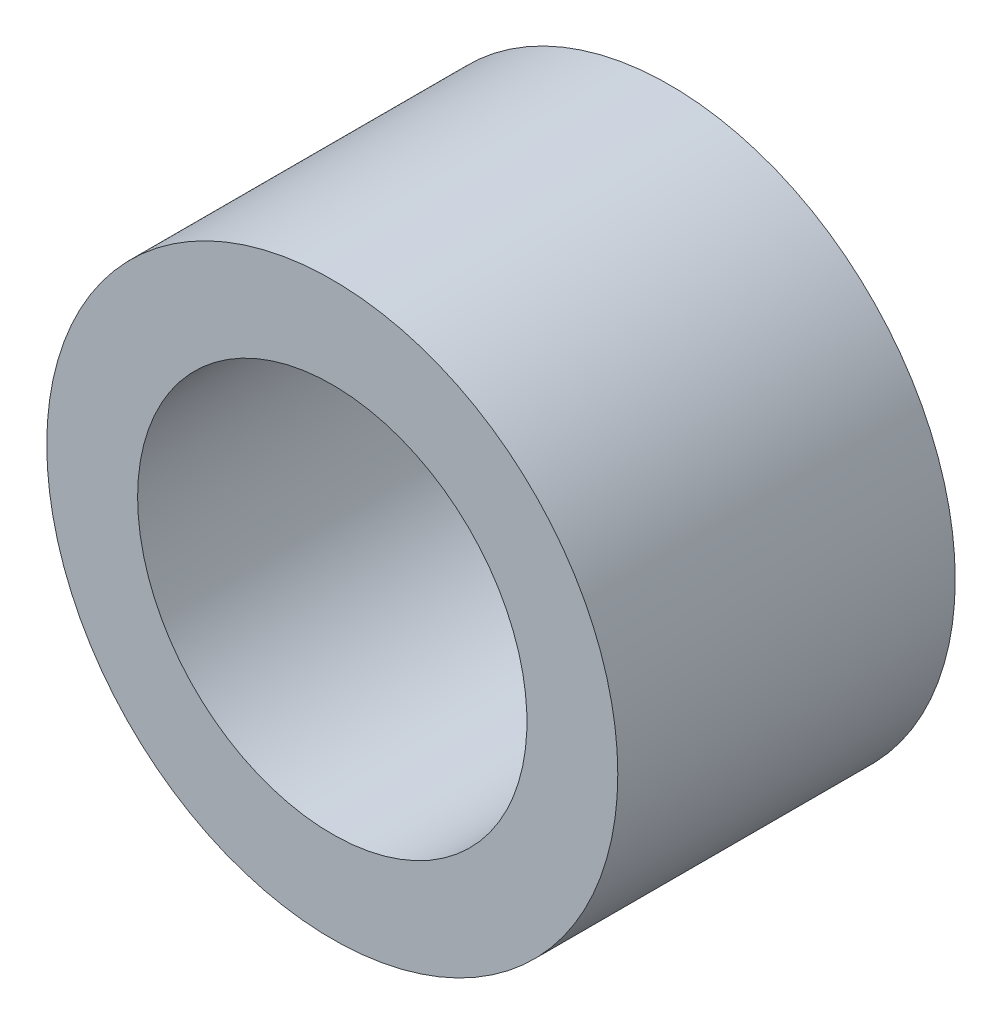
ISO-10303-21;
HEADER;
FILE_DESCRIPTION(('STEP AP214'),'2;1');
FILE_NAME('part.step','',(''),(''),'','','');
FILE_SCHEMA(('AUTOMOTIVE_DESIGN { 1 0 10303 214 1 1 1 1 }'));
ENDSEC;
DATA;
#1=APPLICATION_CONTEXT('core data for automotive mechanical design processes');
#2=APPLICATION_PROTOCOL_DEFINITION('international standard','automotive_design',2000,#1);
#3=PRODUCT_CONTEXT('',#1,'mechanical');
#4=PRODUCT('Part','Part','',(#3));
#5=PRODUCT_RELATED_PRODUCT_CATEGORY('part','',(#4));
#6=PRODUCT_DEFINITION_FORMATION('','',#4);
#7=PRODUCT_DEFINITION_CONTEXT('part definition',#1,'design');
#8=PRODUCT_DEFINITION('design','',#6,#7);
#9=PRODUCT_DEFINITION_SHAPE('','',#8);
#10=(LENGTH_UNIT() NAMED_UNIT(*) SI_UNIT(.MILLI.,.METRE.));
#11=(NAMED_UNIT(*) PLANE_ANGLE_UNIT() SI_UNIT($,.RADIAN.));
#12=(NAMED_UNIT(*) SI_UNIT($,.STERADIAN.) SOLID_ANGLE_UNIT());
#13=UNCERTAINTY_MEASURE_WITH_UNIT(LENGTH_MEASURE(1.E-05),#10,'distance_accuracy_value','');
#14=(GEOMETRIC_REPRESENTATION_CONTEXT(3) GLOBAL_UNCERTAINTY_ASSIGNED_CONTEXT((#13)) GLOBAL_UNIT_ASSIGNED_CONTEXT((#10,
#11,#12)) REPRESENTATION_CONTEXT('',''));
#15=CARTESIAN_POINT('',(0.,0.,0.));
#16=DIRECTION('',(0.,0.,1.));
#17=DIRECTION('',(1.,0.,0.));
#18=AXIS2_PLACEMENT_3D('',#15,#16,#17);
#19=CARTESIAN_POINT('',(0.,0.,13.));
#20=DIRECTION('',(0.,0.,1.));
#21=DIRECTION('',(1.,0.,0.));
#22=AXIS2_PLACEMENT_3D('',#19,#20,#21);
#23=PLANE('',#22);
#24=CARTESIAN_POINT('',(0.,0.,13.));
#25=DIRECTION('',(0.,0.,1.));
#26=DIRECTION('',(1.,0.,0.));
#27=AXIS2_PLACEMENT_3D('',#24,#25,#26);
#28=CIRCLE('',#27,11.);
#29=CARTESIAN_POINT('',(-11.,0.,13.));
#30=VERTEX_POINT('',#29);
#31=EDGE_CURVE('E10',#30,#30,#28,.T.);
#32=ORIENTED_EDGE('',*,*,#31,.T.);
#33=EDGE_LOOP('',(#32));
#34=FACE_BOUND('',#33,.T.);
#35=CARTESIAN_POINT('',(0.,0.,13.));
#36=DIRECTION('',(0.,0.,1.));
#37=DIRECTION('',(1.,0.,0.));
#38=AXIS2_PLACEMENT_3D('',#35,#36,#37);
#39=CIRCLE('',#38,7.5);
#40=CARTESIAN_POINT('',(-7.5,0.,13.));
#41=VERTEX_POINT('',#40);
#42=EDGE_CURVE('E50',#41,#41,#39,.T.);
#43=ORIENTED_EDGE('',*,*,#42,.F.);
#44=EDGE_LOOP('',(#43));
#45=FACE_BOUND('',#44,.T.);
#46=ADVANCED_FACE('F37',(#34,#45),#23,.T.);
#47=CARTESIAN_POINT('',(0.,0.,0.));
#48=DIRECTION('',(0.,0.,1.));
#49=DIRECTION('',(1.,0.,0.));
#50=AXIS2_PLACEMENT_3D('',#47,#48,#49);
#51=PLANE('',#50);
#52=CARTESIAN_POINT('',(0.,0.,0.));
#53=DIRECTION('',(0.,0.,1.));
#54=DIRECTION('',(1.,0.,0.));
#55=AXIS2_PLACEMENT_3D('',#52,#53,#54);
#56=CIRCLE('',#55,11.);
#57=CARTESIAN_POINT('',(-11.,0.,0.));
#58=VERTEX_POINT('',#57);
#59=EDGE_CURVE('E41',#58,#58,#56,.T.);
#60=ORIENTED_EDGE('',*,*,#59,.F.);
#61=EDGE_LOOP('',(#60));
#62=FACE_BOUND('',#61,.T.);
#63=CARTESIAN_POINT('',(0.,0.,0.));
#64=DIRECTION('',(0.,0.,1.));
#65=DIRECTION('',(1.,0.,0.));
#66=AXIS2_PLACEMENT_3D('',#63,#64,#65);
#67=CIRCLE('',#66,7.5);
#68=CARTESIAN_POINT('',(-7.5,0.,0.));
#69=VERTEX_POINT('',#68);
#70=EDGE_CURVE('E52',#69,#69,#67,.T.);
#71=ORIENTED_EDGE('',*,*,#70,.T.);
#72=EDGE_LOOP('',(#71));
#73=FACE_BOUND('',#72,.T.);
#74=ADVANCED_FACE('F64',(#62,#73),#51,.F.);
#75=CARTESIAN_POINT('',(0.,0.,13.));
#76=DIRECTION('',(0.,0.,-1.));
#77=DIRECTION('',(-1.,0.,0.));
#78=AXIS2_PLACEMENT_3D('',#75,#76,#77);
#79=CYLINDRICAL_SURFACE('',#78,11.);
#80=CARTESIAN_POINT('',(-11.,0.,13.));
#81=CARTESIAN_POINT('',(-11.,0.,12.8645833333333));
#82=CARTESIAN_POINT('',(-11.,0.,12.7291666666667));
#83=CARTESIAN_POINT('',(-11.,0.,12.4583333333333));
#84=CARTESIAN_POINT('',(-11.,0.,12.3229166666667));
#85=CARTESIAN_POINT('',(-11.,0.,12.0520833333333));
#86=CARTESIAN_POINT('',(-11.,0.,11.9166666666667));
#87=CARTESIAN_POINT('',(-11.,0.,11.6458333333333));
#88=CARTESIAN_POINT('',(-11.,0.,11.5104166666667));
#89=CARTESIAN_POINT('',(-11.,0.,11.2395833333333));
#90=CARTESIAN_POINT('',(-11.,0.,11.1041666666667));
#91=CARTESIAN_POINT('',(-11.,0.,10.8333333333333));
#92=CARTESIAN_POINT('',(-11.,0.,10.6979166666667));
#93=CARTESIAN_POINT('',(-11.,0.,10.4270833333333));
#94=CARTESIAN_POINT('',(-11.,0.,10.2916666666667));
#95=CARTESIAN_POINT('',(-11.,0.,10.0208333333333));
#96=CARTESIAN_POINT('',(-11.,0.,9.88541666666667));
#97=CARTESIAN_POINT('',(-11.,0.,9.61458333333333));
#98=CARTESIAN_POINT('',(-11.,0.,9.47916666666667));
#99=CARTESIAN_POINT('',(-11.,0.,9.20833333333333));
#100=CARTESIAN_POINT('',(-11.,0.,9.07291666666666));
#101=CARTESIAN_POINT('',(-11.,0.,8.80208333333333));
#102=CARTESIAN_POINT('',(-11.,0.,8.66666666666667));
#103=CARTESIAN_POINT('',(-11.,0.,8.39583333333333));
#104=CARTESIAN_POINT('',(-11.,0.,8.26041666666667));
#105=CARTESIAN_POINT('',(-11.,0.,7.98958333333333));
#106=CARTESIAN_POINT('',(-11.,0.,7.85416666666667));
#107=CARTESIAN_POINT('',(-11.,0.,7.58333333333333));
#108=CARTESIAN_POINT('',(-11.,0.,7.44791666666667));
#109=CARTESIAN_POINT('',(-11.,0.,7.17708333333333));
#110=CARTESIAN_POINT('',(-11.,0.,7.04166666666667));
#111=CARTESIAN_POINT('',(-11.,0.,6.77083333333333));
#112=CARTESIAN_POINT('',(-11.,0.,6.63541666666667));
#113=CARTESIAN_POINT('',(-11.,0.,6.36458333333333));
#114=CARTESIAN_POINT('',(-11.,0.,6.22916666666667));
#115=CARTESIAN_POINT('',(-11.,0.,5.95833333333333));
#116=CARTESIAN_POINT('',(-11.,0.,5.82291666666667));
#117=CARTESIAN_POINT('',(-11.,0.,5.55208333333333));
#118=CARTESIAN_POINT('',(-11.,0.,5.41666666666667));
#119=CARTESIAN_POINT('',(-11.,0.,5.14583333333333));
#120=CARTESIAN_POINT('',(-11.,0.,5.01041666666667));
#121=CARTESIAN_POINT('',(-11.,0.,4.73958333333333));
#122=CARTESIAN_POINT('',(-11.,0.,4.60416666666667));
#123=CARTESIAN_POINT('',(-11.,0.,4.33333333333333));
#124=CARTESIAN_POINT('',(-11.,0.,4.19791666666667));
#125=CARTESIAN_POINT('',(-11.,0.,3.92708333333333));
#126=CARTESIAN_POINT('',(-11.,0.,3.79166666666667));
#127=CARTESIAN_POINT('',(-11.,0.,3.52083333333333));
#128=CARTESIAN_POINT('',(-11.,0.,3.38541666666667));
#129=CARTESIAN_POINT('',(-11.,0.,3.11458333333333));
#130=CARTESIAN_POINT('',(-11.,0.,2.97916666666667));
#131=CARTESIAN_POINT('',(-11.,0.,2.70833333333333));
#132=CARTESIAN_POINT('',(-11.,0.,2.57291666666667));
#133=CARTESIAN_POINT('',(-11.,0.,2.30208333333333));
#134=CARTESIAN_POINT('',(-11.,0.,2.16666666666667));
#135=CARTESIAN_POINT('',(-11.,0.,1.89583333333333));
#136=CARTESIAN_POINT('',(-11.,0.,1.76041666666667));
#137=CARTESIAN_POINT('',(-11.,0.,1.48958333333333));
#138=CARTESIAN_POINT('',(-11.,0.,1.35416666666667));
#139=CARTESIAN_POINT('',(-11.,0.,1.08333333333333));
#140=CARTESIAN_POINT('',(-11.,0.,0.947916666666667));
#141=CARTESIAN_POINT('',(-11.,0.,0.677083333333334));
#142=CARTESIAN_POINT('',(-11.,0.,0.541666666666667));
#143=CARTESIAN_POINT('',(-11.,0.,0.270833333333334));
#144=CARTESIAN_POINT('',(-11.,0.,0.135416666666667));
#145=CARTESIAN_POINT('',(-11.,0.,0.));
#146=B_SPLINE_CURVE_WITH_KNOTS('',3,(#80,#81,#82,#83,#84,#85,#86,#87,#88,#89,#90,#91,#92,#93,
#94,#95,#96,#97,#98,#99,#100,#101,#102,#103,#104,#105,#106,#107,#108,#109,#110,#111,#112,#113,
#114,#115,#116,#117,#118,#119,#120,#121,#122,#123,#124,#125,#126,#127,#128,#129,#130,#131,#132,
#133,#134,#135,#136,#137,#138,#139,#140,#141,#142,#143,#144,#145),.UNSPECIFIED.,.F.,.F.,(4,2,2,
2,2,2,2,2,2,2,2,2,2,2,2,2,2,2,2,2,2,2,2,2,2,2,2,2,2,2,2,2,4),(0.,0.40625,0.812500000000001,
1.21875,1.625,2.03125,2.4375,2.84375,3.25,3.65625,4.0625,4.46875,4.875,5.28125,5.6875,6.09375,
6.5,6.90625,7.3125,7.71875,8.125,8.53125,8.9375,9.34375,9.75,10.15625,10.5625,10.96875,11.375,
11.78125,12.1875,12.59375,13.),.UNSPECIFIED.);
#147=EDGE_CURVE('BSEAM39',#30,#58,#146,.T.);
#148=ORIENTED_EDGE('',*,*,#31,.F.);
#149=ORIENTED_EDGE('',*,*,#59,.T.);
#150=ORIENTED_EDGE('',*,*,#147,.T.);
#151=ORIENTED_EDGE('',*,*,#147,.F.);
#152=EDGE_LOOP('',(#148,#150,#149,#151));
#153=FACE_BOUND('',#152,.T.);
#154=ADVANCED_FACE('F39',(#153),#79,.T.);
#155=CARTESIAN_POINT('',(0.,0.,13.));
#156=DIRECTION('',(0.,0.,-1.));
#157=DIRECTION('',(-1.,0.,0.));
#158=AXIS2_PLACEMENT_3D('',#155,#156,#157);
#159=CYLINDRICAL_SURFACE('',#158,7.5);
#160=CARTESIAN_POINT('',(-7.5,0.,13.));
#161=CARTESIAN_POINT('',(-7.5,0.,12.8645833333333));
#162=CARTESIAN_POINT('',(-7.5,0.,12.7291666666667));
#163=CARTESIAN_POINT('',(-7.5,0.,12.4583333333333));
#164=CARTESIAN_POINT('',(-7.5,0.,12.3229166666667));
#165=CARTESIAN_POINT('',(-7.5,0.,12.0520833333333));
#166=CARTESIAN_POINT('',(-7.5,0.,11.9166666666667));
#167=CARTESIAN_POINT('',(-7.5,0.,11.6458333333333));
#168=CARTESIAN_POINT('',(-7.5,0.,11.5104166666667));
#169=CARTESIAN_POINT('',(-7.5,0.,11.2395833333333));
#170=CARTESIAN_POINT('',(-7.5,0.,11.1041666666667));
#171=CARTESIAN_POINT('',(-7.5,0.,10.8333333333333));
#172=CARTESIAN_POINT('',(-7.5,0.,10.6979166666667));
#173=CARTESIAN_POINT('',(-7.5,0.,10.4270833333333));
#174=CARTESIAN_POINT('',(-7.5,0.,10.2916666666667));
#175=CARTESIAN_POINT('',(-7.5,0.,10.0208333333333));
#176=CARTESIAN_POINT('',(-7.5,0.,9.88541666666667));
#177=CARTESIAN_POINT('',(-7.5,0.,9.61458333333333));
#178=CARTESIAN_POINT('',(-7.5,0.,9.47916666666667));
#179=CARTESIAN_POINT('',(-7.5,0.,9.20833333333333));
#180=CARTESIAN_POINT('',(-7.5,0.,9.07291666666666));
#181=CARTESIAN_POINT('',(-7.5,0.,8.80208333333333));
#182=CARTESIAN_POINT('',(-7.5,0.,8.66666666666667));
#183=CARTESIAN_POINT('',(-7.5,0.,8.39583333333333));
#184=CARTESIAN_POINT('',(-7.5,0.,8.26041666666667));
#185=CARTESIAN_POINT('',(-7.5,0.,7.98958333333333));
#186=CARTESIAN_POINT('',(-7.5,0.,7.85416666666667));
#187=CARTESIAN_POINT('',(-7.5,0.,7.58333333333333));
#188=CARTESIAN_POINT('',(-7.5,0.,7.44791666666667));
#189=CARTESIAN_POINT('',(-7.5,0.,7.17708333333333));
#190=CARTESIAN_POINT('',(-7.5,0.,7.04166666666667));
#191=CARTESIAN_POINT('',(-7.5,0.,6.77083333333333));
#192=CARTESIAN_POINT('',(-7.5,0.,6.63541666666667));
#193=CARTESIAN_POINT('',(-7.5,0.,6.36458333333333));
#194=CARTESIAN_POINT('',(-7.5,0.,6.22916666666667));
#195=CARTESIAN_POINT('',(-7.5,0.,5.95833333333333));
#196=CARTESIAN_POINT('',(-7.5,0.,5.82291666666667));
#197=CARTESIAN_POINT('',(-7.5,0.,5.55208333333333));
#198=CARTESIAN_POINT('',(-7.5,0.,5.41666666666667));
#199=CARTESIAN_POINT('',(-7.5,0.,5.14583333333333));
#200=CARTESIAN_POINT('',(-7.5,0.,5.01041666666667));
#201=CARTESIAN_POINT('',(-7.5,0.,4.73958333333333));
#202=CARTESIAN_POINT('',(-7.5,0.,4.60416666666667));
#203=CARTESIAN_POINT('',(-7.5,0.,4.33333333333333));
#204=CARTESIAN_POINT('',(-7.5,0.,4.19791666666667));
#205=CARTESIAN_POINT('',(-7.5,0.,3.92708333333333));
#206=CARTESIAN_POINT('',(-7.5,0.,3.79166666666667));
#207=CARTESIAN_POINT('',(-7.5,0.,3.52083333333333));
#208=CARTESIAN_POINT('',(-7.5,0.,3.38541666666667));
#209=CARTESIAN_POINT('',(-7.5,0.,3.11458333333333));
#210=CARTESIAN_POINT('',(-7.5,0.,2.97916666666667));
#211=CARTESIAN_POINT('',(-7.5,0.,2.70833333333333));
#212=CARTESIAN_POINT('',(-7.5,0.,2.57291666666667));
#213=CARTESIAN_POINT('',(-7.5,0.,2.30208333333333));
#214=CARTESIAN_POINT('',(-7.5,0.,2.16666666666667));
#215=CARTESIAN_POINT('',(-7.5,0.,1.89583333333333));
#216=CARTESIAN_POINT('',(-7.5,0.,1.76041666666667));
#217=CARTESIAN_POINT('',(-7.5,0.,1.48958333333333));
#218=CARTESIAN_POINT('',(-7.5,0.,1.35416666666667));
#219=CARTESIAN_POINT('',(-7.5,0.,1.08333333333333));
#220=CARTESIAN_POINT('',(-7.5,0.,0.947916666666667));
#221=CARTESIAN_POINT('',(-7.5,0.,0.677083333333334));
#222=CARTESIAN_POINT('',(-7.5,0.,0.541666666666667));
#223=CARTESIAN_POINT('',(-7.5,0.,0.270833333333334));
#224=CARTESIAN_POINT('',(-7.5,0.,0.135416666666667));
#225=CARTESIAN_POINT('',(-7.5,0.,0.));
#226=B_SPLINE_CURVE_WITH_KNOTS('',3,(#160,#161,#162,#163,#164,#165,#166,#167,#168,#169,#170,
#171,#172,#173,#174,#175,#176,#177,#178,#179,#180,#181,#182,#183,#184,#185,#186,#187,#188,#189,
#190,#191,#192,#193,#194,#195,#196,#197,#198,#199,#200,#201,#202,#203,#204,#205,#206,#207,#208,
#209,#210,#211,#212,#213,#214,#215,#216,#217,#218,#219,#220,#221,#222,#223,#224,#225),
.UNSPECIFIED.,.F.,.F.,(4,2,2,2,2,2,2,2,2,2,2,2,2,2,2,2,2,2,2,2,2,2,2,2,2,2,2,2,2,2,2,2,4),(0.,
0.40625,0.812500000000001,1.21875,1.625,2.03125,2.4375,2.84375,3.25,3.65625,4.0625,4.46875,
4.875,5.28125,5.6875,6.09375,6.5,6.90625,7.3125,7.71875,8.125,8.53125,8.9375,9.34375,9.75,
10.15625,10.5625,10.96875,11.375,11.78125,12.1875,12.59375,13.),.UNSPECIFIED.);
#227=EDGE_CURVE('BSEAM60',#41,#69,#226,.T.);
#228=ORIENTED_EDGE('',*,*,#42,.T.);
#229=ORIENTED_EDGE('',*,*,#70,.F.);
#230=ORIENTED_EDGE('',*,*,#227,.T.);
#231=ORIENTED_EDGE('',*,*,#227,.F.);
#232=EDGE_LOOP('',(#228,#230,#229,#231));
#233=FACE_BOUND('',#232,.T.);
#234=ADVANCED_FACE('F60',(#233),#159,.F.);
#235=CLOSED_SHELL('',(#46,#74,#154,#234));
#236=MANIFOLD_SOLID_BREP('B2',#235);
#237=ADVANCED_BREP_SHAPE_REPRESENTATION('',(#18,#236),#14);
#238=SHAPE_DEFINITION_REPRESENTATION(#9,#237);
ENDSEC;
END-ISO-10303-21;
